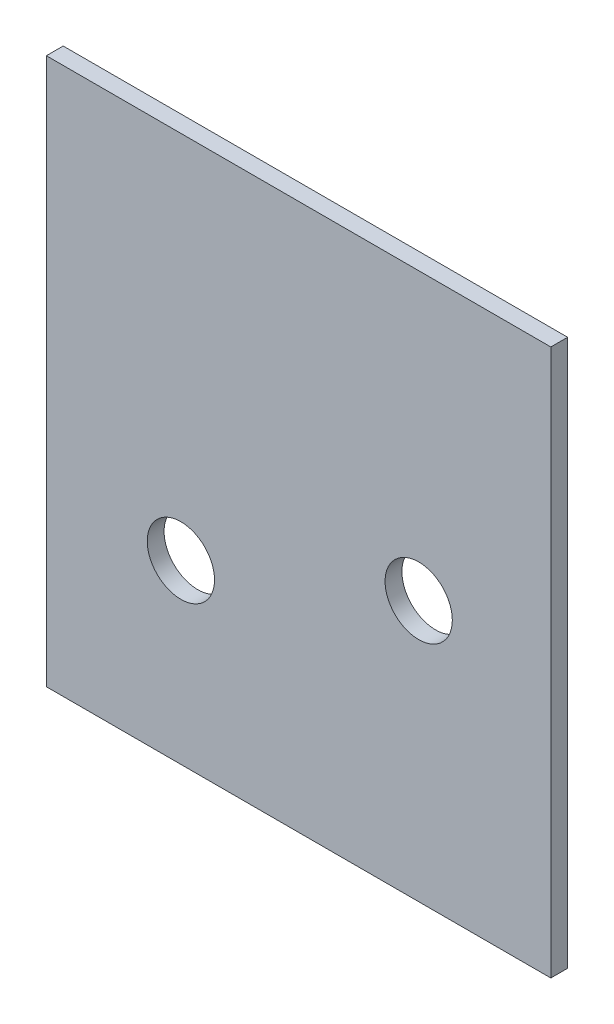
ISO-10303-21;
HEADER;
FILE_DESCRIPTION(('STEP AP214'),'2;1');
FILE_NAME('part.step','',(''),(''),'','','');
FILE_SCHEMA(('AUTOMOTIVE_DESIGN { 1 0 10303 214 1 1 1 1 }'));
ENDSEC;
DATA;
#1=APPLICATION_CONTEXT('core data for automotive mechanical design processes');
#2=APPLICATION_PROTOCOL_DEFINITION('international standard','automotive_design',2000,#1);
#3=PRODUCT_CONTEXT('',#1,'mechanical');
#4=PRODUCT('Part','Part','',(#3));
#5=PRODUCT_RELATED_PRODUCT_CATEGORY('part','',(#4));
#6=PRODUCT_DEFINITION_FORMATION('','',#4);
#7=PRODUCT_DEFINITION_CONTEXT('part definition',#1,'design');
#8=PRODUCT_DEFINITION('design','',#6,#7);
#9=PRODUCT_DEFINITION_SHAPE('','',#8);
#10=(LENGTH_UNIT() NAMED_UNIT(*) SI_UNIT(.MILLI.,.METRE.));
#11=(NAMED_UNIT(*) PLANE_ANGLE_UNIT() SI_UNIT($,.RADIAN.));
#12=(NAMED_UNIT(*) SI_UNIT($,.STERADIAN.) SOLID_ANGLE_UNIT());
#13=UNCERTAINTY_MEASURE_WITH_UNIT(LENGTH_MEASURE(1.E-05),#10,'distance_accuracy_value','');
#14=(GEOMETRIC_REPRESENTATION_CONTEXT(3) GLOBAL_UNCERTAINTY_ASSIGNED_CONTEXT((#13)) GLOBAL_UNIT_ASSIGNED_CONTEXT((#10,
#11,#12)) REPRESENTATION_CONTEXT('',''));
#15=CARTESIAN_POINT('',(0.,0.,0.));
#16=DIRECTION('',(0.,0.,1.));
#17=DIRECTION('',(1.,0.,0.));
#18=AXIS2_PLACEMENT_3D('',#15,#16,#17);
#19=CARTESIAN_POINT('',(150.,-150.,10.));
#20=DIRECTION('',(-1.,0.,0.));
#21=DIRECTION('',(0.,0.,1.));
#22=AXIS2_PLACEMENT_3D('',#19,#20,#21);
#23=PLANE('',#22);
#24=DIRECTION('',(0.,1.,0.));
#25=VECTOR('',#24,1.);
#26=CARTESIAN_POINT('',(150.,-150.,0.));
#27=LINE('',#26,#25);
#28=CARTESIAN_POINT('',(150.,-175.,0.));
#29=VERTEX_POINT('',#28);
#30=CARTESIAN_POINT('',(150.,150.,0.));
#31=VERTEX_POINT('',#30);
#32=EDGE_CURVE('E99',#29,#31,#27,.T.);
#33=ORIENTED_EDGE('',*,*,#32,.T.);
#34=DIRECTION('',(0.,0.,-1.));
#35=VECTOR('',#34,1.);
#36=CARTESIAN_POINT('',(150.,150.,10.));
#37=LINE('',#36,#35);
#38=CARTESIAN_POINT('',(150.,150.,10.));
#39=VERTEX_POINT('',#38);
#40=EDGE_CURVE('E11',#39,#31,#37,.T.);
#41=ORIENTED_EDGE('',*,*,#40,.F.);
#42=DIRECTION('',(0.,1.,0.));
#43=VECTOR('',#42,1.);
#44=CARTESIAN_POINT('',(150.,-150.,10.));
#45=LINE('',#44,#43);
#46=CARTESIAN_POINT('',(150.,-175.,10.));
#47=VERTEX_POINT('',#46);
#48=EDGE_CURVE('E93',#47,#39,#45,.T.);
#49=ORIENTED_EDGE('',*,*,#48,.F.);
#50=DIRECTION('',(0.,0.,1.));
#51=VECTOR('',#50,1.);
#52=CARTESIAN_POINT('',(150.,-175.,0.));
#53=LINE('',#52,#51);
#54=EDGE_CURVE('E103',#29,#47,#53,.T.);
#55=ORIENTED_EDGE('',*,*,#54,.F.);
#56=EDGE_LOOP('',(#33,#41,#49,#55));
#57=FACE_BOUND('',#56,.T.);
#58=ADVANCED_FACE('F45',(#57),#23,.F.);
#59=CARTESIAN_POINT('',(-150.,150.,10.));
#60=DIRECTION('',(0.,-1.,0.));
#61=DIRECTION('',(0.,0.,-1.));
#62=AXIS2_PLACEMENT_3D('',#59,#60,#61);
#63=PLANE('',#62);
#64=DIRECTION('',(-1.,0.,0.));
#65=VECTOR('',#64,1.);
#66=CARTESIAN_POINT('',(-150.,150.,0.));
#67=LINE('',#66,#65);
#68=CARTESIAN_POINT('',(-150.,150.,0.));
#69=VERTEX_POINT('',#68);
#70=EDGE_CURVE('E72',#31,#69,#67,.T.);
#71=ORIENTED_EDGE('',*,*,#70,.T.);
#72=DIRECTION('',(0.,0.,-1.));
#73=VECTOR('',#72,1.);
#74=CARTESIAN_POINT('',(-150.,150.,10.));
#75=LINE('',#74,#73);
#76=CARTESIAN_POINT('',(-150.,150.,10.));
#77=VERTEX_POINT('',#76);
#78=EDGE_CURVE('E53',#77,#69,#75,.T.);
#79=ORIENTED_EDGE('',*,*,#78,.F.);
#80=DIRECTION('',(-1.,0.,0.));
#81=VECTOR('',#80,1.);
#82=CARTESIAN_POINT('',(-150.,150.,10.));
#83=LINE('',#82,#81);
#84=EDGE_CURVE('E61',#39,#77,#83,.T.);
#85=ORIENTED_EDGE('',*,*,#84,.F.);
#86=ORIENTED_EDGE('',*,*,#40,.T.);
#87=EDGE_LOOP('',(#71,#79,#85,#86));
#88=FACE_BOUND('',#87,.T.);
#89=ADVANCED_FACE('F128',(#88),#63,.F.);
#90=CARTESIAN_POINT('',(-150.,-150.,10.));
#91=DIRECTION('',(1.,0.,0.));
#92=DIRECTION('',(0.,0.,-1.));
#93=AXIS2_PLACEMENT_3D('',#90,#91,#92);
#94=PLANE('',#93);
#95=DIRECTION('',(0.,-1.,0.));
#96=VECTOR('',#95,1.);
#97=CARTESIAN_POINT('',(-150.,-150.,0.));
#98=LINE('',#97,#96);
#99=CARTESIAN_POINT('',(-150.,-175.,0.));
#100=VERTEX_POINT('',#99);
#101=EDGE_CURVE('E88',#69,#100,#98,.T.);
#102=ORIENTED_EDGE('',*,*,#101,.T.);
#103=DIRECTION('',(0.,0.,-1.));
#104=VECTOR('',#103,1.);
#105=CARTESIAN_POINT('',(-150.,-175.,10.));
#106=LINE('',#105,#104);
#107=CARTESIAN_POINT('',(-150.,-175.,10.));
#108=VERTEX_POINT('',#107);
#109=EDGE_CURVE('E92',#108,#100,#106,.T.);
#110=ORIENTED_EDGE('',*,*,#109,.F.);
#111=DIRECTION('',(0.,-1.,0.));
#112=VECTOR('',#111,1.);
#113=CARTESIAN_POINT('',(-150.,-150.,10.));
#114=LINE('',#113,#112);
#115=EDGE_CURVE('E76',#77,#108,#114,.T.);
#116=ORIENTED_EDGE('',*,*,#115,.F.);
#117=ORIENTED_EDGE('',*,*,#78,.T.);
#118=EDGE_LOOP('',(#102,#110,#116,#117));
#119=FACE_BOUND('',#118,.T.);
#120=ADVANCED_FACE('F90',(#119),#94,.F.);
#121=CARTESIAN_POINT('',(0.,0.,10.));
#122=DIRECTION('',(0.,0.,-1.));
#123=DIRECTION('',(-1.,0.,0.));
#124=AXIS2_PLACEMENT_3D('',#121,#122,#123);
#125=PLANE('',#124);
#126=CARTESIAN_POINT('',(-70.,-70.,10.));
#127=DIRECTION('',(0.,0.,1.));
#128=DIRECTION('',(1.,0.,0.));
#129=AXIS2_PLACEMENT_3D('',#126,#127,#128);
#130=CIRCLE('',#129,20.);
#131=CARTESIAN_POINT('',(-50.,-70.,10.));
#132=VERTEX_POINT('',#131);
#133=EDGE_CURVE('E115',#132,#132,#130,.T.);
#134=ORIENTED_EDGE('',*,*,#133,.F.);
#135=EDGE_LOOP('',(#134));
#136=FACE_BOUND('',#135,.T.);
#137=CARTESIAN_POINT('',(71.4213562373095,-20.,10.));
#138=DIRECTION('',(0.,0.,1.));
#139=DIRECTION('',(1.,0.,0.));
#140=AXIS2_PLACEMENT_3D('',#137,#138,#139);
#141=CIRCLE('',#140,20.);
#142=CARTESIAN_POINT('',(91.4213562373095,-20.,10.));
#143=VERTEX_POINT('',#142);
#144=EDGE_CURVE('E118',#143,#143,#141,.T.);
#145=ORIENTED_EDGE('',*,*,#144,.F.);
#146=EDGE_LOOP('',(#145));
#147=FACE_BOUND('',#146,.T.);
#148=ORIENTED_EDGE('',*,*,#48,.T.);
#149=ORIENTED_EDGE('',*,*,#84,.T.);
#150=ORIENTED_EDGE('',*,*,#115,.T.);
#151=DIRECTION('',(-1.,0.,0.));
#152=VECTOR('',#151,1.);
#153=CARTESIAN_POINT('',(150.,-175.,10.));
#154=LINE('',#153,#152);
#155=EDGE_CURVE('E106',#47,#108,#154,.T.);
#156=ORIENTED_EDGE('',*,*,#155,.F.);
#157=EDGE_LOOP('',(#148,#149,#150,#156));
#158=FACE_BOUND('',#157,.T.);
#159=ADVANCED_FACE('F131',(#136,#147,#158),#125,.F.);
#160=CARTESIAN_POINT('',(0.,0.,0.));
#161=DIRECTION('',(0.,0.,-1.));
#162=DIRECTION('',(-1.,0.,0.));
#163=AXIS2_PLACEMENT_3D('',#160,#161,#162);
#164=PLANE('',#163);
#165=CARTESIAN_POINT('',(-70.,-70.,0.));
#166=DIRECTION('',(0.,0.,1.));
#167=DIRECTION('',(1.,0.,0.));
#168=AXIS2_PLACEMENT_3D('',#165,#166,#167);
#169=CIRCLE('',#168,20.);
#170=CARTESIAN_POINT('',(-50.,-70.,0.));
#171=VERTEX_POINT('',#170);
#172=EDGE_CURVE('E112',#171,#171,#169,.T.);
#173=ORIENTED_EDGE('',*,*,#172,.T.);
#174=EDGE_LOOP('',(#173));
#175=FACE_BOUND('',#174,.T.);
#176=CARTESIAN_POINT('',(71.4213562373095,-20.,0.));
#177=DIRECTION('',(0.,0.,1.));
#178=DIRECTION('',(1.,0.,0.));
#179=AXIS2_PLACEMENT_3D('',#176,#177,#178);
#180=CIRCLE('',#179,20.);
#181=CARTESIAN_POINT('',(91.4213562373095,-20.,0.));
#182=VERTEX_POINT('',#181);
#183=EDGE_CURVE('E111',#182,#182,#180,.T.);
#184=ORIENTED_EDGE('',*,*,#183,.T.);
#185=EDGE_LOOP('',(#184));
#186=FACE_BOUND('',#185,.T.);
#187=ORIENTED_EDGE('',*,*,#32,.F.);
#188=DIRECTION('',(1.,0.,0.));
#189=VECTOR('',#188,1.);
#190=CARTESIAN_POINT('',(-150.,-175.,0.));
#191=LINE('',#190,#189);
#192=EDGE_CURVE('E96',#100,#29,#191,.T.);
#193=ORIENTED_EDGE('',*,*,#192,.F.);
#194=ORIENTED_EDGE('',*,*,#101,.F.);
#195=ORIENTED_EDGE('',*,*,#70,.F.);
#196=EDGE_LOOP('',(#187,#193,#194,#195));
#197=FACE_BOUND('',#196,.T.);
#198=ADVANCED_FACE('F97',(#175,#186,#197),#164,.T.);
#199=CARTESIAN_POINT('',(71.4213562373095,-20.,0.));
#200=DIRECTION('',(0.,0.,1.));
#201=DIRECTION('',(1.,0.,0.));
#202=AXIS2_PLACEMENT_3D('',#199,#200,#201);
#203=CYLINDRICAL_SURFACE('',#202,20.);
#204=ORIENTED_EDGE('',*,*,#183,.F.);
#205=EDGE_LOOP('',(#204));
#206=FACE_BOUND('',#205,.T.);
#207=ORIENTED_EDGE('',*,*,#144,.T.);
#208=EDGE_LOOP('',(#207));
#209=FACE_BOUND('',#208,.T.);
#210=ADVANCED_FACE('F139',(#206,#209),#203,.F.);
#211=CARTESIAN_POINT('',(-70.,-70.,0.));
#212=DIRECTION('',(0.,0.,1.));
#213=DIRECTION('',(1.,0.,0.));
#214=AXIS2_PLACEMENT_3D('',#211,#212,#213);
#215=CYLINDRICAL_SURFACE('',#214,20.);
#216=ORIENTED_EDGE('',*,*,#172,.F.);
#217=EDGE_LOOP('',(#216));
#218=FACE_BOUND('',#217,.T.);
#219=ORIENTED_EDGE('',*,*,#133,.T.);
#220=EDGE_LOOP('',(#219));
#221=FACE_BOUND('',#220,.T.);
#222=ADVANCED_FACE('F161',(#218,#221),#215,.F.);
#223=CARTESIAN_POINT('',(0.,-175.,0.));
#224=DIRECTION('',(0.,-1.,0.));
#225=DIRECTION('',(0.,0.,-1.));
#226=AXIS2_PLACEMENT_3D('',#223,#224,#225);
#227=PLANE('',#226);
#228=ORIENTED_EDGE('',*,*,#109,.T.);
#229=ORIENTED_EDGE('',*,*,#192,.T.);
#230=ORIENTED_EDGE('',*,*,#54,.T.);
#231=ORIENTED_EDGE('',*,*,#155,.T.);
#232=EDGE_LOOP('',(#228,#229,#230,#231));
#233=FACE_BOUND('',#232,.T.);
#234=ADVANCED_FACE('F105',(#233),#227,.T.);
#235=CLOSED_SHELL('',(#58,#89,#120,#159,#198,#210,#222,#234));
#236=MANIFOLD_SOLID_BREP('B2',#235);
#237=ADVANCED_BREP_SHAPE_REPRESENTATION('',(#18,#236),#14);
#238=SHAPE_DEFINITION_REPRESENTATION(#9,#237);
ENDSEC;
END-ISO-10303-21;
